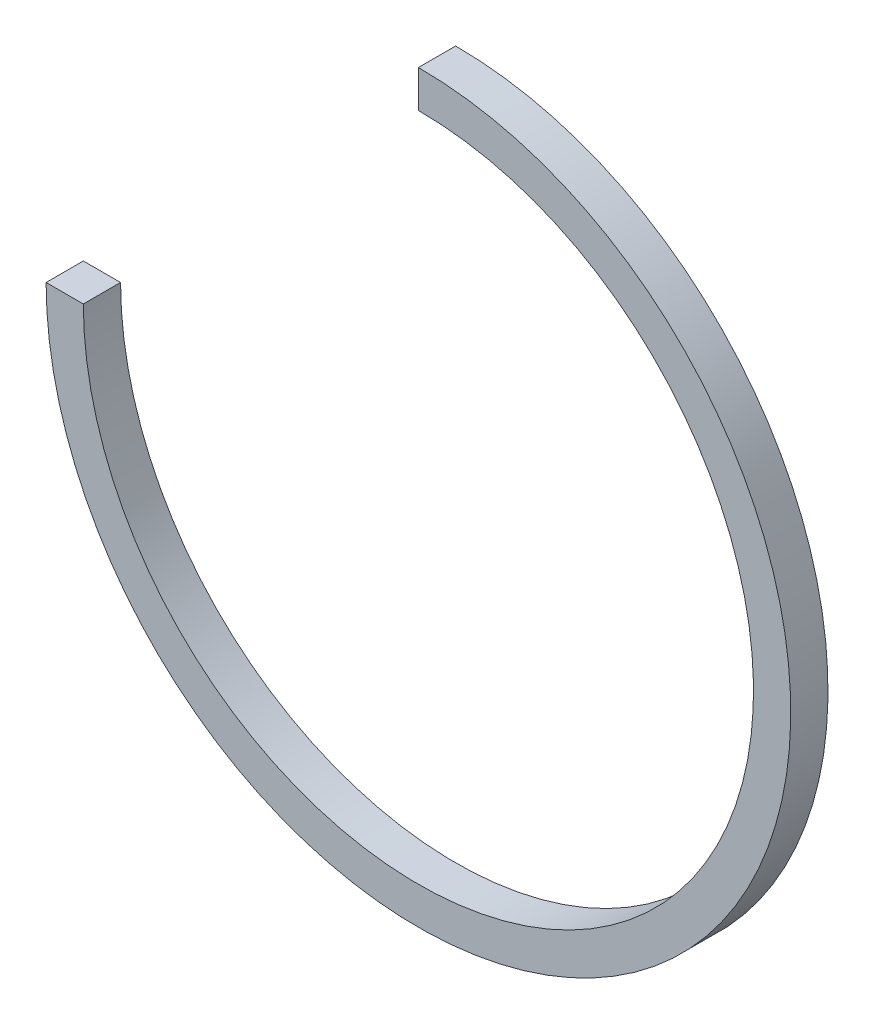
ISO-10303-21;
HEADER;
FILE_DESCRIPTION(('STEP AP214'),'2;1');
FILE_NAME('part.step','',(''),(''),'','','');
FILE_SCHEMA(('AUTOMOTIVE_DESIGN { 1 0 10303 214 1 1 1 1 }'));
ENDSEC;
DATA;
#1=APPLICATION_CONTEXT('core data for automotive mechanical design processes');
#2=APPLICATION_PROTOCOL_DEFINITION('international standard','automotive_design',2000,#1);
#3=PRODUCT_CONTEXT('',#1,'mechanical');
#4=PRODUCT('Part','Part','',(#3));
#5=PRODUCT_RELATED_PRODUCT_CATEGORY('part','',(#4));
#6=PRODUCT_DEFINITION_FORMATION('','',#4);
#7=PRODUCT_DEFINITION_CONTEXT('part definition',#1,'design');
#8=PRODUCT_DEFINITION('design','',#6,#7);
#9=PRODUCT_DEFINITION_SHAPE('','',#8);
#10=(LENGTH_UNIT() NAMED_UNIT(*) SI_UNIT(.MILLI.,.METRE.));
#11=(NAMED_UNIT(*) PLANE_ANGLE_UNIT() SI_UNIT($,.RADIAN.));
#12=(NAMED_UNIT(*) SI_UNIT($,.STERADIAN.) SOLID_ANGLE_UNIT());
#13=UNCERTAINTY_MEASURE_WITH_UNIT(LENGTH_MEASURE(1.E-05),#10,'distance_accuracy_value','');
#14=(GEOMETRIC_REPRESENTATION_CONTEXT(3) GLOBAL_UNCERTAINTY_ASSIGNED_CONTEXT((#13)) GLOBAL_UNIT_ASSIGNED_CONTEXT((#10,
#11,#12)) REPRESENTATION_CONTEXT('',''));
#15=CARTESIAN_POINT('',(0.,0.,0.));
#16=DIRECTION('',(0.,0.,1.));
#17=DIRECTION('',(1.,0.,0.));
#18=AXIS2_PLACEMENT_3D('',#15,#16,#17);
#19=CARTESIAN_POINT('',(0.,0.,10.));
#20=DIRECTION('',(0.,0.,-1.));
#21=DIRECTION('',(-1.,0.,0.));
#22=AXIS2_PLACEMENT_3D('',#19,#20,#21);
#23=CYLINDRICAL_SURFACE('',#22,100.);
#24=CARTESIAN_POINT('',(0.,0.,0.));
#25=DIRECTION('',(0.,0.,1.));
#26=DIRECTION('',(-1.,0.,0.));
#27=AXIS2_PLACEMENT_3D('',#24,#25,#26);
#28=CIRCLE('',#27,100.);
#29=CARTESIAN_POINT('',(-100.,0.,0.));
#30=VERTEX_POINT('',#29);
#31=CARTESIAN_POINT('',(0.,100.,0.));
#32=VERTEX_POINT('',#31);
#33=EDGE_CURVE('E107',#30,#32,#28,.T.);
#34=ORIENTED_EDGE('',*,*,#33,.T.);
#35=DIRECTION('',(0.,0.,-1.));
#36=VECTOR('',#35,1.);
#37=CARTESIAN_POINT('',(0.,100.,10.));
#38=LINE('',#37,#36);
#39=CARTESIAN_POINT('',(0.,100.,10.));
#40=VERTEX_POINT('',#39);
#41=EDGE_CURVE('E11',#40,#32,#38,.T.);
#42=ORIENTED_EDGE('',*,*,#41,.F.);
#43=CARTESIAN_POINT('',(0.,0.,10.));
#44=DIRECTION('',(0.,0.,1.));
#45=DIRECTION('',(-1.,0.,0.));
#46=AXIS2_PLACEMENT_3D('',#43,#44,#45);
#47=CIRCLE('',#46,100.);
#48=CARTESIAN_POINT('',(-100.,0.,10.));
#49=VERTEX_POINT('',#48);
#50=EDGE_CURVE('E91',#49,#40,#47,.T.);
#51=ORIENTED_EDGE('',*,*,#50,.F.);
#52=DIRECTION('',(0.,0.,-1.));
#53=VECTOR('',#52,1.);
#54=CARTESIAN_POINT('',(-100.,0.,10.));
#55=LINE('',#54,#53);
#56=EDGE_CURVE('E103',#49,#30,#55,.T.);
#57=ORIENTED_EDGE('',*,*,#56,.T.);
#58=EDGE_LOOP('',(#34,#42,#51,#57));
#59=FACE_BOUND('',#58,.T.);
#60=ADVANCED_FACE('F39',(#59),#23,.T.);
#61=CARTESIAN_POINT('',(0.,100.,10.));
#62=DIRECTION('',(1.,0.,0.));
#63=DIRECTION('',(0.,1.,0.));
#64=AXIS2_PLACEMENT_3D('',#61,#62,#63);
#65=PLANE('',#64);
#66=DIRECTION('',(0.,-1.,0.));
#67=VECTOR('',#66,1.);
#68=CARTESIAN_POINT('',(0.,100.,0.));
#69=LINE('',#68,#67);
#70=CARTESIAN_POINT('',(0.,90.,0.));
#71=VERTEX_POINT('',#70);
#72=EDGE_CURVE('E96',#32,#71,#69,.T.);
#73=ORIENTED_EDGE('',*,*,#72,.T.);
#74=DIRECTION('',(0.,0.,-1.));
#75=VECTOR('',#74,1.);
#76=CARTESIAN_POINT('',(0.,90.,10.));
#77=LINE('',#76,#75);
#78=CARTESIAN_POINT('',(0.,90.,10.));
#79=VERTEX_POINT('',#78);
#80=EDGE_CURVE('E48',#79,#71,#77,.T.);
#81=ORIENTED_EDGE('',*,*,#80,.F.);
#82=DIRECTION('',(0.,-1.,0.));
#83=VECTOR('',#82,1.);
#84=CARTESIAN_POINT('',(0.,100.,10.));
#85=LINE('',#84,#83);
#86=EDGE_CURVE('E86',#40,#79,#85,.T.);
#87=ORIENTED_EDGE('',*,*,#86,.F.);
#88=ORIENTED_EDGE('',*,*,#41,.T.);
#89=EDGE_LOOP('',(#73,#81,#87,#88));
#90=FACE_BOUND('',#89,.T.);
#91=ADVANCED_FACE('F95',(#90),#65,.F.);
#92=CARTESIAN_POINT('',(0.,0.,10.));
#93=DIRECTION('',(0.,0.,-1.));
#94=DIRECTION('',(-1.,0.,0.));
#95=AXIS2_PLACEMENT_3D('',#92,#93,#94);
#96=CYLINDRICAL_SURFACE('',#95,90.);
#97=CARTESIAN_POINT('',(0.,0.,0.));
#98=DIRECTION('',(0.,0.,-1.));
#99=DIRECTION('',(1.,0.,0.));
#100=AXIS2_PLACEMENT_3D('',#97,#98,#99);
#101=CIRCLE('',#100,90.);
#102=CARTESIAN_POINT('',(-90.,0.,0.));
#103=VERTEX_POINT('',#102);
#104=EDGE_CURVE('E73',#71,#103,#101,.T.);
#105=ORIENTED_EDGE('',*,*,#104,.T.);
#106=DIRECTION('',(0.,0.,-1.));
#107=VECTOR('',#106,1.);
#108=CARTESIAN_POINT('',(-90.,0.,10.));
#109=LINE('',#108,#107);
#110=CARTESIAN_POINT('',(-90.,0.,10.));
#111=VERTEX_POINT('',#110);
#112=EDGE_CURVE('E98',#111,#103,#109,.T.);
#113=ORIENTED_EDGE('',*,*,#112,.F.);
#114=CARTESIAN_POINT('',(0.,0.,10.));
#115=DIRECTION('',(0.,0.,-1.));
#116=DIRECTION('',(1.,0.,0.));
#117=AXIS2_PLACEMENT_3D('',#114,#115,#116);
#118=CIRCLE('',#117,90.);
#119=EDGE_CURVE('E89',#79,#111,#118,.T.);
#120=ORIENTED_EDGE('',*,*,#119,.F.);
#121=ORIENTED_EDGE('',*,*,#80,.T.);
#122=EDGE_LOOP('',(#105,#113,#120,#121));
#123=FACE_BOUND('',#122,.T.);
#124=ADVANCED_FACE('F99',(#123),#96,.F.);
#125=CARTESIAN_POINT('',(-100.,0.,10.));
#126=DIRECTION('',(0.,-1.,0.));
#127=DIRECTION('',(0.,0.,-1.));
#128=AXIS2_PLACEMENT_3D('',#125,#126,#127);
#129=PLANE('',#128);
#130=DIRECTION('',(-1.,0.,0.));
#131=VECTOR('',#130,1.);
#132=CARTESIAN_POINT('',(-100.,0.,0.));
#133=LINE('',#132,#131);
#134=EDGE_CURVE('E79',#103,#30,#133,.T.);
#135=ORIENTED_EDGE('',*,*,#134,.T.);
#136=ORIENTED_EDGE('',*,*,#56,.F.);
#137=DIRECTION('',(-1.,0.,0.));
#138=VECTOR('',#137,1.);
#139=CARTESIAN_POINT('',(-100.,0.,10.));
#140=LINE('',#139,#138);
#141=EDGE_CURVE('E56',#111,#49,#140,.T.);
#142=ORIENTED_EDGE('',*,*,#141,.F.);
#143=ORIENTED_EDGE('',*,*,#112,.T.);
#144=EDGE_LOOP('',(#135,#136,#142,#143));
#145=FACE_BOUND('',#144,.T.);
#146=ADVANCED_FACE('F120',(#145),#129,.F.);
#147=CARTESIAN_POINT('',(0.,0.,10.));
#148=DIRECTION('',(0.,0.,-1.));
#149=DIRECTION('',(-1.,0.,0.));
#150=AXIS2_PLACEMENT_3D('',#147,#148,#149);
#151=PLANE('',#150);
#152=ORIENTED_EDGE('',*,*,#50,.T.);
#153=ORIENTED_EDGE('',*,*,#86,.T.);
#154=ORIENTED_EDGE('',*,*,#119,.T.);
#155=ORIENTED_EDGE('',*,*,#141,.T.);
#156=EDGE_LOOP('',(#152,#153,#154,#155));
#157=FACE_BOUND('',#156,.T.);
#158=ADVANCED_FACE('F87',(#157),#151,.F.);
#159=CARTESIAN_POINT('',(0.,0.,0.));
#160=DIRECTION('',(0.,0.,-1.));
#161=DIRECTION('',(-1.,0.,0.));
#162=AXIS2_PLACEMENT_3D('',#159,#160,#161);
#163=PLANE('',#162);
#164=ORIENTED_EDGE('',*,*,#33,.F.);
#165=ORIENTED_EDGE('',*,*,#134,.F.);
#166=ORIENTED_EDGE('',*,*,#104,.F.);
#167=ORIENTED_EDGE('',*,*,#72,.F.);
#168=EDGE_LOOP('',(#164,#165,#166,#167));
#169=FACE_BOUND('',#168,.T.);
#170=ADVANCED_FACE('F123',(#169),#163,.T.);
#171=CLOSED_SHELL('',(#60,#91,#124,#146,#158,#170));
#172=MANIFOLD_SOLID_BREP('B2',#171);
#173=ADVANCED_BREP_SHAPE_REPRESENTATION('',(#18,#172),#14);
#174=SHAPE_DEFINITION_REPRESENTATION(#9,#173);
ENDSEC;
END-ISO-10303-21;
